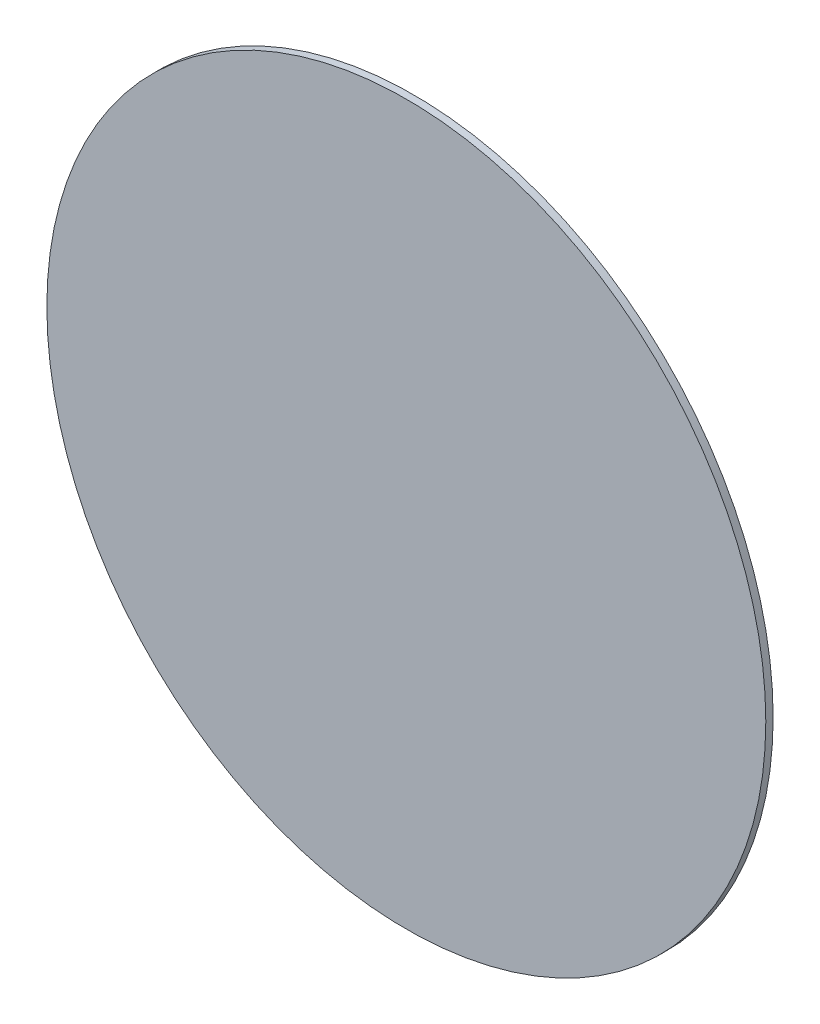
ISO-10303-21;
HEADER;
FILE_DESCRIPTION(('STEP AP214'),'2;1');
FILE_NAME('part.step','',(''),(''),'','','');
FILE_SCHEMA(('AUTOMOTIVE_DESIGN { 1 0 10303 214 1 1 1 1 }'));
ENDSEC;
DATA;
#1=APPLICATION_CONTEXT('core data for automotive mechanical design processes');
#2=APPLICATION_PROTOCOL_DEFINITION('international standard','automotive_design',2000,#1);
#3=PRODUCT_CONTEXT('',#1,'mechanical');
#4=PRODUCT('Part','Part','',(#3));
#5=PRODUCT_RELATED_PRODUCT_CATEGORY('part','',(#4));
#6=PRODUCT_DEFINITION_FORMATION('','',#4);
#7=PRODUCT_DEFINITION_CONTEXT('part definition',#1,'design');
#8=PRODUCT_DEFINITION('design','',#6,#7);
#9=PRODUCT_DEFINITION_SHAPE('','',#8);
#10=(LENGTH_UNIT() NAMED_UNIT(*) SI_UNIT(.MILLI.,.METRE.));
#11=(NAMED_UNIT(*) PLANE_ANGLE_UNIT() SI_UNIT($,.RADIAN.));
#12=(NAMED_UNIT(*) SI_UNIT($,.STERADIAN.) SOLID_ANGLE_UNIT());
#13=UNCERTAINTY_MEASURE_WITH_UNIT(LENGTH_MEASURE(1.E-05),#10,'distance_accuracy_value','');
#14=(GEOMETRIC_REPRESENTATION_CONTEXT(3) GLOBAL_UNCERTAINTY_ASSIGNED_CONTEXT((#13)) GLOBAL_UNIT_ASSIGNED_CONTEXT((#10,
#11,#12)) REPRESENTATION_CONTEXT('',''));
#15=CARTESIAN_POINT('',(0.,0.,0.));
#16=DIRECTION('',(0.,0.,1.));
#17=DIRECTION('',(1.,0.,0.));
#18=AXIS2_PLACEMENT_3D('',#15,#16,#17);
#19=CARTESIAN_POINT('',(0.,0.,3.));
#20=DIRECTION('',(0.,0.,-1.));
#21=DIRECTION('',(-1.,0.,0.));
#22=AXIS2_PLACEMENT_3D('',#19,#20,#21);
#23=CYLINDRICAL_SURFACE('',#22,147.);
#24=CARTESIAN_POINT('',(0.,0.,3.));
#25=DIRECTION('',(0.,0.,1.));
#26=DIRECTION('',(1.,0.,0.));
#27=AXIS2_PLACEMENT_3D('',#24,#25,#26);
#28=CIRCLE('',#27,147.);
#29=CARTESIAN_POINT('',(147.,0.,3.));
#30=VERTEX_POINT('',#29);
#31=EDGE_CURVE('E10',#30,#30,#28,.T.);
#32=ORIENTED_EDGE('',*,*,#31,.F.);
#33=EDGE_LOOP('',(#32));
#34=FACE_BOUND('',#33,.T.);
#35=CARTESIAN_POINT('',(0.,0.,0.));
#36=DIRECTION('',(0.,0.,1.));
#37=DIRECTION('',(1.,0.,0.));
#38=AXIS2_PLACEMENT_3D('',#35,#36,#37);
#39=CIRCLE('',#38,147.);
#40=CARTESIAN_POINT('',(147.,0.,0.));
#41=VERTEX_POINT('',#40);
#42=EDGE_CURVE('E33',#41,#41,#39,.T.);
#43=ORIENTED_EDGE('',*,*,#42,.T.);
#44=EDGE_LOOP('',(#43));
#45=FACE_BOUND('',#44,.T.);
#46=ADVANCED_FACE('F30',(#34,#45),#23,.T.);
#47=CARTESIAN_POINT('',(0.,0.,3.));
#48=DIRECTION('',(0.,0.,1.));
#49=DIRECTION('',(1.,0.,0.));
#50=AXIS2_PLACEMENT_3D('',#47,#48,#49);
#51=PLANE('',#50);
#52=ORIENTED_EDGE('',*,*,#31,.T.);
#53=EDGE_LOOP('',(#52));
#54=FACE_BOUND('',#53,.T.);
#55=ADVANCED_FACE('F45',(#54),#51,.T.);
#56=CARTESIAN_POINT('',(0.,0.,0.));
#57=DIRECTION('',(0.,0.,1.));
#58=DIRECTION('',(1.,0.,0.));
#59=AXIS2_PLACEMENT_3D('',#56,#57,#58);
#60=PLANE('',#59);
#61=ORIENTED_EDGE('',*,*,#42,.F.);
#62=EDGE_LOOP('',(#61));
#63=FACE_BOUND('',#62,.T.);
#64=ADVANCED_FACE('F43',(#63),#60,.F.);
#65=CLOSED_SHELL('',(#46,#55,#64));
#66=MANIFOLD_SOLID_BREP('B2',#65);
#67=ADVANCED_BREP_SHAPE_REPRESENTATION('',(#18,#66),#14);
#68=SHAPE_DEFINITION_REPRESENTATION(#9,#67);
ENDSEC;
END-ISO-10303-21;
